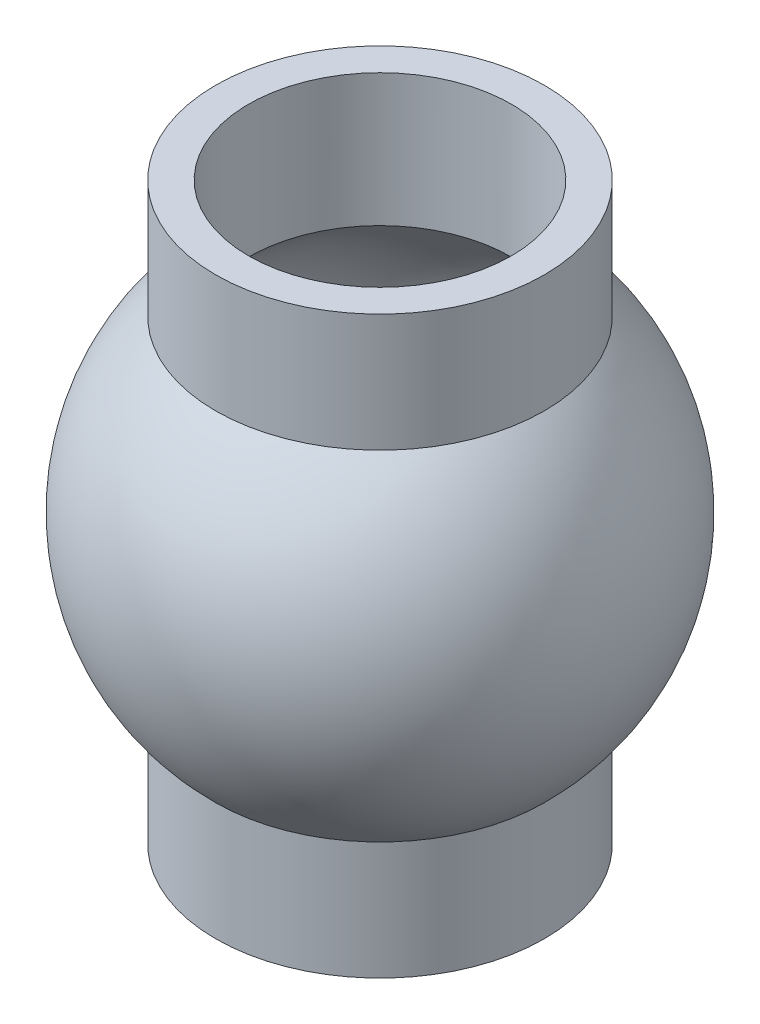
ISO-10303-21;
HEADER;
FILE_DESCRIPTION(('STEP AP214'),'2;1');
FILE_NAME('part.step','',(''),(''),'','','');
FILE_SCHEMA(('AUTOMOTIVE_DESIGN { 1 0 10303 214 1 1 1 1 }'));
ENDSEC;
DATA;
#1=APPLICATION_CONTEXT('core data for automotive mechanical design processes');
#2=APPLICATION_PROTOCOL_DEFINITION('international standard','automotive_design',2000,#1);
#3=PRODUCT_CONTEXT('',#1,'mechanical');
#4=PRODUCT('Part','Part','',(#3));
#5=PRODUCT_RELATED_PRODUCT_CATEGORY('part','',(#4));
#6=PRODUCT_DEFINITION_FORMATION('','',#4);
#7=PRODUCT_DEFINITION_CONTEXT('part definition',#1,'design');
#8=PRODUCT_DEFINITION('design','',#6,#7);
#9=PRODUCT_DEFINITION_SHAPE('','',#8);
#10=(LENGTH_UNIT() NAMED_UNIT(*) SI_UNIT(.MILLI.,.METRE.));
#11=(NAMED_UNIT(*) PLANE_ANGLE_UNIT() SI_UNIT($,.RADIAN.));
#12=(NAMED_UNIT(*) SI_UNIT($,.STERADIAN.) SOLID_ANGLE_UNIT());
#13=UNCERTAINTY_MEASURE_WITH_UNIT(LENGTH_MEASURE(1.E-05),#10,'distance_accuracy_value','');
#14=(GEOMETRIC_REPRESENTATION_CONTEXT(3) GLOBAL_UNCERTAINTY_ASSIGNED_CONTEXT((#13)) GLOBAL_UNIT_ASSIGNED_CONTEXT((#10,
#11,#12)) REPRESENTATION_CONTEXT('',''));
#15=CARTESIAN_POINT('',(0.,0.,0.));
#16=DIRECTION('',(0.,0.,1.));
#17=DIRECTION('',(1.,0.,0.));
#18=AXIS2_PLACEMENT_3D('',#15,#16,#17);
#19=CARTESIAN_POINT('',(0.,3.5,0.));
#20=DIRECTION('',(0.,-1.,0.));
#21=DIRECTION('',(0.,0.,-1.));
#22=AXIS2_PLACEMENT_3D('',#19,#20,#21);
#23=CYLINDRICAL_SURFACE('',#22,2.);
#24=CARTESIAN_POINT('',(0.,-2.06533895523229,0.));
#25=DIRECTION('',(0.,1.,0.));
#26=DIRECTION('',(0.,0.,1.));
#27=AXIS2_PLACEMENT_3D('',#24,#25,#26);
#28=CIRCLE('',#27,2.);
#29=CARTESIAN_POINT('',(2.,-2.06533895523229,0.));
#30=VERTEX_POINT('',#29);
#31=EDGE_CURVE('E10',#30,#30,#28,.T.);
#32=ORIENTED_EDGE('',*,*,#31,.F.);
#33=EDGE_LOOP('',(#32));
#34=FACE_BOUND('',#33,.T.);
#35=CARTESIAN_POINT('',(0.,-3.5,0.));
#36=DIRECTION('',(0.,1.,0.));
#37=DIRECTION('',(0.,0.,1.));
#38=AXIS2_PLACEMENT_3D('',#35,#36,#37);
#39=CIRCLE('',#38,2.);
#40=CARTESIAN_POINT('',(0.,-3.5,2.));
#41=VERTEX_POINT('',#40);
#42=EDGE_CURVE('E45',#41,#41,#39,.T.);
#43=ORIENTED_EDGE('',*,*,#42,.T.);
#44=EDGE_LOOP('',(#43));
#45=FACE_BOUND('',#44,.T.);
#46=ADVANCED_FACE('F30',(#34,#45),#23,.T.);
#47=CARTESIAN_POINT('',(0.,-3.5,0.));
#48=DIRECTION('',(0.,1.,0.));
#49=DIRECTION('',(0.,0.,1.));
#50=AXIS2_PLACEMENT_3D('',#47,#48,#49);
#51=PLANE('',#50);
#52=CARTESIAN_POINT('',(0.,-3.5,0.));
#53=DIRECTION('',(0.,1.,0.));
#54=DIRECTION('',(0.,0.,1.));
#55=AXIS2_PLACEMENT_3D('',#52,#53,#54);
#56=CIRCLE('',#55,1.6);
#57=CARTESIAN_POINT('',(0.,-3.5,1.6));
#58=VERTEX_POINT('',#57);
#59=EDGE_CURVE('E55',#58,#58,#56,.T.);
#60=ORIENTED_EDGE('',*,*,#59,.T.);
#61=EDGE_LOOP('',(#60));
#62=FACE_BOUND('',#61,.T.);
#63=ORIENTED_EDGE('',*,*,#42,.F.);
#64=EDGE_LOOP('',(#63));
#65=FACE_BOUND('',#64,.T.);
#66=ADVANCED_FACE('F81',(#62,#65),#51,.F.);
#67=CARTESIAN_POINT('',(0.,0.,0.));
#68=DIRECTION('',(0.,1.,0.));
#69=DIRECTION('',(1.,0.,0.));
#70=AXIS2_PLACEMENT_3D('',#67,#68,#69);
#71=SPHERICAL_SURFACE('',#70,2.875);
#72=CARTESIAN_POINT('',(0.,2.06533895523229,0.));
#73=DIRECTION('',(0.,-1.,0.));
#74=DIRECTION('',(0.,0.,-1.));
#75=AXIS2_PLACEMENT_3D('',#72,#73,#74);
#76=CIRCLE('',#75,2.);
#77=CARTESIAN_POINT('',(2.,2.06533895523229,0.));
#78=VERTEX_POINT('',#77);
#79=EDGE_CURVE('E37',#78,#78,#76,.T.);
#80=CARTESIAN_POINT('',(2.,2.06533895523229,0.));
#81=CARTESIAN_POINT('',(2.03448631366641,2.03194515501014,0.));
#82=CARTESIAN_POINT('',(2.06813468464814,1.99768617201851,0.));
#83=CARTESIAN_POINT('',(2.13367460466364,1.92752703190472,0.));
#84=CARTESIAN_POINT('',(2.1655661536974,1.89162687478255,0.));
#85=CARTESIAN_POINT('',(2.22751149323837,1.81827457781607,0.));
#86=CARTESIAN_POINT('',(2.25756528374557,1.78082243797176,0.));
#87=CARTESIAN_POINT('',(2.31575996090171,1.7044603635627,0.));
#88=CARTESIAN_POINT('',(2.34390084755064,1.66555042899795,0.));
#89=CARTESIAN_POINT('',(2.39819905406509,1.58637031466971,0.));
#90=CARTESIAN_POINT('',(2.42435637393061,1.54610013490622,0.));
#91=CARTESIAN_POINT('',(2.47462184484426,1.46430057130706,0.));
#92=CARTESIAN_POINT('',(2.49872999589238,1.42277118747137,0.));
#93=CARTESIAN_POINT('',(2.54483664509673,1.33855739455246,0.));
#94=CARTESIAN_POINT('',(2.56683514325295,1.29587298546923,0.));
#95=CARTESIAN_POINT('',(2.60866730109864,1.2094562241379,0.));
#96=CARTESIAN_POINT('',(2.62850096078811,1.16572387188981,0.));
#97=CARTESIAN_POINT('',(2.66595368534873,1.07732093372599,0.));
#98=CARTESIAN_POINT('',(2.68357275021988,1.03265034781026,0.));
#99=CARTESIAN_POINT('',(2.71655208490573,0.942483005930612,0.));
#100=CARTESIAN_POINT('',(2.73191235472043,0.896986249966688,0.));
#101=CARTESIAN_POINT('',(2.76033556549814,0.805280704084517,0.));
#102=CARTESIAN_POINT('',(2.77339850646116,0.75907191416627,0.));
#103=CARTESIAN_POINT('',(2.797194289,0.666058222753265,0.));
#104=CARTESIAN_POINT('',(2.80792713057582,0.619253321258507,0.));
#105=CARTESIAN_POINT('',(2.82703578923504,0.525164824506657,0.));
#106=CARTESIAN_POINT('',(2.83541160631844,0.477881229249565,0.));
#107=CARTESIAN_POINT('',(2.84978520387454,0.382953963671591,0.));
#108=CARTESIAN_POINT('',(2.85578298434724,0.335310293350708,0.));
#109=CARTESIAN_POINT('',(2.86538546226017,0.239782399650824,0.));
#110=CARTESIAN_POINT('',(2.86899015970041,0.191898176271822,0.));
#111=CARTESIAN_POINT('',(2.87379742857032,0.096009301928547,0.));
#112=CARTESIAN_POINT('',(2.875,0.0480046509642735,0.));
#113=CARTESIAN_POINT('',(2.875,-0.0480046509642735,0.));
#114=CARTESIAN_POINT('',(2.87379742857032,-0.096009301928547,0.));
#115=CARTESIAN_POINT('',(2.86899015970041,-0.191898176271822,0.));
#116=CARTESIAN_POINT('',(2.86538546226017,-0.239782399650824,0.));
#117=CARTESIAN_POINT('',(2.85578298434724,-0.335310293350708,0.));
#118=CARTESIAN_POINT('',(2.84978520387454,-0.382953963671591,0.));
#119=CARTESIAN_POINT('',(2.83541160631844,-0.477881229249565,0.));
#120=CARTESIAN_POINT('',(2.82703578923504,-0.525164824506657,0.));
#121=CARTESIAN_POINT('',(2.80792713057582,-0.619253321258507,0.));
#122=CARTESIAN_POINT('',(2.797194289,-0.666058222753264,0.));
#123=CARTESIAN_POINT('',(2.77339850646116,-0.759071914166269,0.));
#124=CARTESIAN_POINT('',(2.76033556549814,-0.805280704084516,0.));
#125=CARTESIAN_POINT('',(2.73191235472043,-0.896986249966688,0.));
#126=CARTESIAN_POINT('',(2.71655208490573,-0.942483005930612,0.));
#127=CARTESIAN_POINT('',(2.68357275021988,-1.03265034781026,0.));
#128=CARTESIAN_POINT('',(2.66595368534873,-1.07732093372599,0.));
#129=CARTESIAN_POINT('',(2.62850096078811,-1.16572387188981,0.));
#130=CARTESIAN_POINT('',(2.60866730109864,-1.2094562241379,0.));
#131=CARTESIAN_POINT('',(2.56683514325295,-1.29587298546923,0.));
#132=CARTESIAN_POINT('',(2.54483664509673,-1.33855739455246,0.));
#133=CARTESIAN_POINT('',(2.49872999589238,-1.42277118747137,0.));
#134=CARTESIAN_POINT('',(2.47462184484426,-1.46430057130706,0.));
#135=CARTESIAN_POINT('',(2.42435637393061,-1.54610013490622,0.));
#136=CARTESIAN_POINT('',(2.39819905406509,-1.58637031466971,0.));
#137=CARTESIAN_POINT('',(2.34390084755064,-1.66555042899795,0.));
#138=CARTESIAN_POINT('',(2.31575996090171,-1.7044603635627,0.));
#139=CARTESIAN_POINT('',(2.25756528374557,-1.78082243797176,0.));
#140=CARTESIAN_POINT('',(2.22751149323837,-1.81827457781607,0.));
#141=CARTESIAN_POINT('',(2.1655661536974,-1.89162687478255,0.));
#142=CARTESIAN_POINT('',(2.13367460466364,-1.92752703190472,0.));
#143=CARTESIAN_POINT('',(2.06813468464814,-1.99768617201851,0.));
#144=CARTESIAN_POINT('',(2.03448631366641,-2.03194515501014,0.));
#145=CARTESIAN_POINT('',(2.,-2.06533895523229,0.));
#146=B_SPLINE_CURVE_WITH_KNOTS('',3,(#80,#81,#82,#83,#84,#85,#86,#87,#88,#89,#90,#91,#92,#93,
#94,#95,#96,#97,#98,#99,#100,#101,#102,#103,#104,#105,#106,#107,#108,#109,#110,#111,#112,#113,
#114,#115,#116,#117,#118,#119,#120,#121,#122,#123,#124,#125,#126,#127,#128,#129,#130,#131,#132,
#133,#134,#135,#136,#137,#138,#139,#140,#141,#142,#143,#144,#145),.UNSPECIFIED.,.F.,.F.,(4,2,2,
2,2,2,2,2,2,2,2,2,2,2,2,2,2,2,2,2,2,2,2,2,2,2,2,2,2,2,2,2,4),(0.,0.143998901807139,
0.287997803614279,0.431996705421418,0.575995607228557,0.719994509035697,0.863993410842836,
1.00799231264998,1.15199121445711,1.29599011626425,1.43998901807139,1.58398791987853,
1.72798682168567,1.87198572349281,2.01598462529995,2.15998352710709,2.30398242891423,
2.44798133072137,2.59198023252851,2.73597913433565,2.87997803614279,3.02397693794993,
3.16797583975706,3.3119747415642,3.45597364337134,3.59997254517848,3.74397144698562,
3.88797034879276,4.0319692505999,4.17596815240704,4.31996705421418,4.46396595602132,
4.60796485782846),.UNSPECIFIED.);
#147=EDGE_CURVE('BSEAM32',#78,#30,#146,.T.);
#148=ORIENTED_EDGE('',*,*,#79,.T.);
#149=ORIENTED_EDGE('',*,*,#31,.T.);
#150=ORIENTED_EDGE('',*,*,#147,.T.);
#151=ORIENTED_EDGE('',*,*,#147,.F.);
#152=EDGE_LOOP('',(#148,#150,#149,#151));
#153=FACE_BOUND('',#152,.T.);
#154=ADVANCED_FACE('F32',(#153),#71,.T.);
#155=CARTESIAN_POINT('',(0.,3.5,0.));
#156=DIRECTION('',(0.,1.,0.));
#157=DIRECTION('',(0.,0.,1.));
#158=AXIS2_PLACEMENT_3D('',#155,#156,#157);
#159=PLANE('',#158);
#160=CARTESIAN_POINT('',(0.,3.5,0.));
#161=DIRECTION('',(0.,1.,0.));
#162=DIRECTION('',(0.,0.,1.));
#163=AXIS2_PLACEMENT_3D('',#160,#161,#162);
#164=CIRCLE('',#163,1.6);
#165=CARTESIAN_POINT('',(0.,3.5,1.6));
#166=VERTEX_POINT('',#165);
#167=EDGE_CURVE('E51',#166,#166,#164,.T.);
#168=ORIENTED_EDGE('',*,*,#167,.F.);
#169=EDGE_LOOP('',(#168));
#170=FACE_BOUND('',#169,.T.);
#171=CARTESIAN_POINT('',(0.,3.5,0.));
#172=DIRECTION('',(0.,1.,0.));
#173=DIRECTION('',(0.,0.,1.));
#174=AXIS2_PLACEMENT_3D('',#171,#172,#173);
#175=CIRCLE('',#174,2.);
#176=CARTESIAN_POINT('',(0.,3.5,2.));
#177=VERTEX_POINT('',#176);
#178=EDGE_CURVE('E41',#177,#177,#175,.T.);
#179=ORIENTED_EDGE('',*,*,#178,.T.);
#180=EDGE_LOOP('',(#179));
#181=FACE_BOUND('',#180,.T.);
#182=ADVANCED_FACE('F90',(#170,#181),#159,.T.);
#183=ORIENTED_EDGE('',*,*,#79,.F.);
#184=EDGE_LOOP('',(#183));
#185=FACE_BOUND('',#184,.T.);
#186=ORIENTED_EDGE('',*,*,#178,.F.);
#187=EDGE_LOOP('',(#186));
#188=FACE_BOUND('',#187,.T.);
#189=ADVANCED_FACE('F77',(#185,#188),#23,.T.);
#190=CARTESIAN_POINT('',(0.,3.5,0.));
#191=DIRECTION('',(0.,-1.,0.));
#192=DIRECTION('',(0.,0.,-1.));
#193=AXIS2_PLACEMENT_3D('',#190,#191,#192);
#194=CYLINDRICAL_SURFACE('',#193,1.6);
#195=CARTESIAN_POINT('',(0.,-1.88828626007817,0.));
#196=DIRECTION('',(0.,1.,0.));
#197=DIRECTION('',(0.,0.,1.));
#198=AXIS2_PLACEMENT_3D('',#195,#196,#197);
#199=CIRCLE('',#198,1.6);
#200=CARTESIAN_POINT('',(1.6,-1.88828626007817,0.));
#201=VERTEX_POINT('',#200);
#202=EDGE_CURVE('E49',#201,#201,#199,.T.);
#203=ORIENTED_EDGE('',*,*,#202,.T.);
#204=EDGE_LOOP('',(#203));
#205=FACE_BOUND('',#204,.T.);
#206=ORIENTED_EDGE('',*,*,#59,.F.);
#207=EDGE_LOOP('',(#206));
#208=FACE_BOUND('',#207,.T.);
#209=ADVANCED_FACE('F63',(#205,#208),#194,.F.);
#210=CARTESIAN_POINT('',(0.,0.,0.));
#211=DIRECTION('',(0.,1.,0.));
#212=DIRECTION('',(1.,0.,0.));
#213=AXIS2_PLACEMENT_3D('',#210,#211,#212);
#214=SPHERICAL_SURFACE('',#213,2.475);
#215=CARTESIAN_POINT('',(0.,1.88828626007817,0.));
#216=DIRECTION('',(0.,-1.,0.));
#217=DIRECTION('',(0.,0.,-1.));
#218=AXIS2_PLACEMENT_3D('',#215,#216,#217);
#219=CIRCLE('',#218,1.6);
#220=CARTESIAN_POINT('',(1.6,1.88828626007817,0.));
#221=VERTEX_POINT('',#220);
#222=EDGE_CURVE('E54',#221,#221,#219,.T.);
#223=CARTESIAN_POINT('',(1.6,1.88828626007817,0.));
#224=CARTESIAN_POINT('',(1.63414167969647,1.85935869766282,0.));
#225=CARTESIAN_POINT('',(1.66749708729236,1.82950337974562,0.));
#226=CARTESIAN_POINT('',(1.7325411146885,1.76802913922773,0.));
#227=CARTESIAN_POINT('',(1.76422973448875,1.73641021662705,0.));
#228=CARTESIAN_POINT('',(1.82584594269914,1.6715006730624,0.));
#229=CARTESIAN_POINT('',(1.85577353110927,1.63821005209844,0.));
#230=CARTESIAN_POINT('',(1.91377992641985,1.57005532514675,0.));
#231=CARTESIAN_POINT('',(1.94185873332031,1.53519121915902,0.));
#232=CARTESIAN_POINT('',(1.99608490142659,1.46399199124283,0.));
#233=CARTESIAN_POINT('',(2.02223226263242,1.42765686931437,0.));
#234=CARTESIAN_POINT('',(2.07251865055219,1.35362250517748,0.));
#235=CARTESIAN_POINT('',(2.09665767726613,1.31592326296905,0.));
#236=CARTESIAN_POINT('',(2.14285638936201,1.23927153955816,0.));
#237=CARTESIAN_POINT('',(2.16491607474396,1.20031905835569,0.));
#238=CARTESIAN_POINT('',(2.2068912201929,1.12127543163106,0.));
#239=CARTESIAN_POINT('',(2.2268066802599,1.08118428610889,0.));
#240=CARTESIAN_POINT('',(2.26443479621406,0.999981252717846,0.));
#241=CARTESIAN_POINT('',(2.28214745210124,0.958869364848963,0.));
#242=CARTESIAN_POINT('',(2.31531786055095,0.875745771619711,0.));
#243=CARTESIAN_POINT('',(2.33077561311348,0.833734066259341,0.));
#244=CARTESIAN_POINT('',(2.35939074811493,0.748934409449145,0.));
#245=CARTESIAN_POINT('',(2.37254813055383,0.706146457999318,0.));
#246=CARTESIAN_POINT('',(2.3965238247541,0.619920163666178,0.));
#247=CARTESIAN_POINT('',(2.40734213651546,0.576481820782866,0.));
#248=CARTESIAN_POINT('',(2.42660786883969,0.489082511262341,0.));
#249=CARTESIAN_POINT('',(2.43505528940256,0.445121544625129,0.));
#250=CARTESIAN_POINT('',(2.44955439244923,0.356806292502175,0.));
#251=CARTESIAN_POINT('',(2.45560607493303,0.312452007016433,0.));
#252=CARTESIAN_POINT('',(2.4652959016617,0.223480578992296,0.));
#253=CARTESIAN_POINT('',(2.46893404590657,0.178863436453901,0.));
#254=CARTESIAN_POINT('',(2.47378609507572,0.0894975292770044,0.));
#255=CARTESIAN_POINT('',(2.475,0.0447487646385022,0.));
#256=CARTESIAN_POINT('',(2.475,-0.0447487646385022,0.));
#257=CARTESIAN_POINT('',(2.47378609507572,-0.0894975292770044,0.));
#258=CARTESIAN_POINT('',(2.46893404590657,-0.178863436453901,0.));
#259=CARTESIAN_POINT('',(2.4652959016617,-0.223480578992296,0.));
#260=CARTESIAN_POINT('',(2.45560607493303,-0.312452007016433,0.));
#261=CARTESIAN_POINT('',(2.44955439244923,-0.356806292502175,0.));
#262=CARTESIAN_POINT('',(2.43505528940256,-0.445121544625129,0.));
#263=CARTESIAN_POINT('',(2.42660786883969,-0.489082511262341,0.));
#264=CARTESIAN_POINT('',(2.40734213651546,-0.576481820782865,0.));
#265=CARTESIAN_POINT('',(2.3965238247541,-0.619920163666178,0.));
#266=CARTESIAN_POINT('',(2.37254813055383,-0.706146457999318,0.));
#267=CARTESIAN_POINT('',(2.35939074811493,-0.748934409449145,0.));
#268=CARTESIAN_POINT('',(2.33077561311348,-0.833734066259341,0.));
#269=CARTESIAN_POINT('',(2.31531786055095,-0.875745771619711,0.));
#270=CARTESIAN_POINT('',(2.28214745210124,-0.958869364848963,0.));
#271=CARTESIAN_POINT('',(2.26443479621406,-0.999981252717846,0.));
#272=CARTESIAN_POINT('',(2.2268066802599,-1.08118428610889,0.));
#273=CARTESIAN_POINT('',(2.2068912201929,-1.12127543163106,0.));
#274=CARTESIAN_POINT('',(2.16491607474396,-1.20031905835569,0.));
#275=CARTESIAN_POINT('',(2.14285638936201,-1.23927153955816,0.));
#276=CARTESIAN_POINT('',(2.09665767726613,-1.31592326296905,0.));
#277=CARTESIAN_POINT('',(2.07251865055219,-1.35362250517748,0.));
#278=CARTESIAN_POINT('',(2.02223226263242,-1.42765686931437,0.));
#279=CARTESIAN_POINT('',(1.99608490142659,-1.46399199124283,0.));
#280=CARTESIAN_POINT('',(1.94185873332031,-1.53519121915902,0.));
#281=CARTESIAN_POINT('',(1.91377992641985,-1.57005532514675,0.));
#282=CARTESIAN_POINT('',(1.85577353110927,-1.63821005209844,0.));
#283=CARTESIAN_POINT('',(1.82584594269914,-1.6715006730624,0.));
#284=CARTESIAN_POINT('',(1.76422973448875,-1.73641021662704,0.));
#285=CARTESIAN_POINT('',(1.7325411146885,-1.76802913922773,0.));
#286=CARTESIAN_POINT('',(1.66749708729236,-1.82950337974562,0.));
#287=CARTESIAN_POINT('',(1.63414167969647,-1.85935869766282,0.));
#288=CARTESIAN_POINT('',(1.6,-1.88828626007817,0.));
#289=B_SPLINE_CURVE_WITH_KNOTS('',3,(#223,#224,#225,#226,#227,#228,#229,#230,#231,#232,#233,
#234,#235,#236,#237,#238,#239,#240,#241,#242,#243,#244,#245,#246,#247,#248,#249,#250,#251,#252,
#253,#254,#255,#256,#257,#258,#259,#260,#261,#262,#263,#264,#265,#266,#267,#268,#269,#270,#271,
#272,#273,#274,#275,#276,#277,#278,#279,#280,#281,#282,#283,#284,#285,#286,#287,#288),
.UNSPECIFIED.,.F.,.F.,(4,2,2,2,2,2,2,2,2,2,2,2,2,2,2,2,2,2,2,2,2,2,2,2,2,2,2,2,2,2,2,2,4),(0.,
0.134229844180925,0.268459688361851,0.402689532542776,0.536919376723701,0.671149220904627,
0.805379065085552,0.939608909266478,1.0738387534474,1.20806859762833,1.34229844180925,
1.47652828599018,1.61075813017111,1.74498797435203,1.87921781853296,2.01344766271388,
2.14767750689481,2.28190735107573,2.41613719525666,2.55036703943758,2.68459688361851,
2.81882672779944,2.95305657198036,3.08728641616129,3.22151626034221,3.35574610452314,
3.48997594870406,3.62420579288499,3.75843563706591,3.89266548124684,4.02689532542776,
4.16112516960869,4.29535501378961),.UNSPECIFIED.);
#290=EDGE_CURVE('BSEAM66',#221,#201,#289,.T.);
#291=ORIENTED_EDGE('',*,*,#222,.F.);
#292=ORIENTED_EDGE('',*,*,#202,.F.);
#293=ORIENTED_EDGE('',*,*,#290,.T.);
#294=ORIENTED_EDGE('',*,*,#290,.F.);
#295=EDGE_LOOP('',(#291,#293,#292,#294));
#296=FACE_BOUND('',#295,.T.);
#297=ADVANCED_FACE('F66',(#296),#214,.F.);
#298=ORIENTED_EDGE('',*,*,#222,.T.);
#299=EDGE_LOOP('',(#298));
#300=FACE_BOUND('',#299,.T.);
#301=ORIENTED_EDGE('',*,*,#167,.T.);
#302=EDGE_LOOP('',(#301));
#303=FACE_BOUND('',#302,.T.);
#304=ADVANCED_FACE('F68',(#300,#303),#194,.F.);
#305=CLOSED_SHELL('',(#46,#66,#154,#182,#189,#209,#297,#304));
#306=MANIFOLD_SOLID_BREP('B2',#305);
#307=ADVANCED_BREP_SHAPE_REPRESENTATION('',(#18,#306),#14);
#308=SHAPE_DEFINITION_REPRESENTATION(#9,#307);
ENDSEC;
END-ISO-10303-21;
